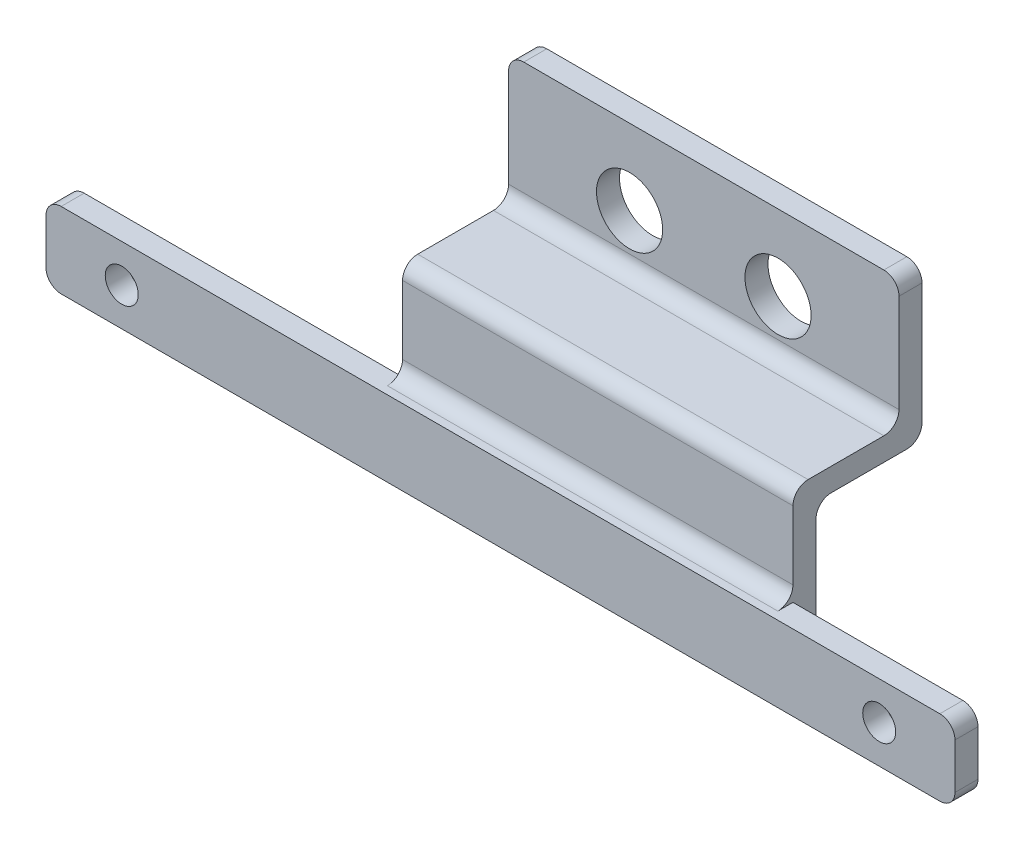
ISO-10303-21;
HEADER;
FILE_DESCRIPTION(('STEP AP214'),'2;1');
FILE_NAME('part.step','',(''),(''),'','','');
FILE_SCHEMA(('AUTOMOTIVE_DESIGN { 1 0 10303 214 1 1 1 1 }'));
ENDSEC;
DATA;
#1=APPLICATION_CONTEXT('core data for automotive mechanical design processes');
#2=APPLICATION_PROTOCOL_DEFINITION('international standard','automotive_design',2000,#1);
#3=PRODUCT_CONTEXT('',#1,'mechanical');
#4=PRODUCT('Part','Part','',(#3));
#5=PRODUCT_RELATED_PRODUCT_CATEGORY('part','',(#4));
#6=PRODUCT_DEFINITION_FORMATION('','',#4);
#7=PRODUCT_DEFINITION_CONTEXT('part definition',#1,'design');
#8=PRODUCT_DEFINITION('design','',#6,#7);
#9=PRODUCT_DEFINITION_SHAPE('','',#8);
#10=(LENGTH_UNIT() NAMED_UNIT(*) SI_UNIT(.MILLI.,.METRE.));
#11=(NAMED_UNIT(*) PLANE_ANGLE_UNIT() SI_UNIT($,.RADIAN.));
#12=(NAMED_UNIT(*) SI_UNIT($,.STERADIAN.) SOLID_ANGLE_UNIT());
#13=UNCERTAINTY_MEASURE_WITH_UNIT(LENGTH_MEASURE(1.E-05),#10,'distance_accuracy_value','');
#14=(GEOMETRIC_REPRESENTATION_CONTEXT(3) GLOBAL_UNCERTAINTY_ASSIGNED_CONTEXT((#13)) GLOBAL_UNIT_ASSIGNED_CONTEXT((#10,
#11,#12)) REPRESENTATION_CONTEXT('',''));
#15=CARTESIAN_POINT('',(0.,0.,0.));
#16=DIRECTION('',(0.,0.,1.));
#17=DIRECTION('',(1.,0.,0.));
#18=AXIS2_PLACEMENT_3D('',#15,#16,#17);
#19=CARTESIAN_POINT('',(0.,0.,8.52));
#20=DIRECTION('',(0.,0.,-1.));
#21=DIRECTION('',(-1.,0.,0.));
#22=AXIS2_PLACEMENT_3D('',#19,#20,#21);
#23=PLANE('',#22);
#24=DIRECTION('',(0.,1.,0.));
#25=VECTOR('',#24,1.);
#26=CARTESIAN_POINT('',(12.885,-3.48,8.52));
#27=LINE('',#26,#25);
#28=CARTESIAN_POINT('',(12.885,-9.,8.52));
#29=VERTEX_POINT('',#28);
#30=CARTESIAN_POINT('',(12.885,-4.48,8.52));
#31=VERTEX_POINT('',#30);
#32=EDGE_CURVE('E315',#29,#31,#27,.T.);
#33=ORIENTED_EDGE('',*,*,#32,.T.);
#34=DIRECTION('',(-1.,0.,0.));
#35=VECTOR('',#34,1.);
#36=CARTESIAN_POINT('',(0.,-4.48,8.52));
#37=LINE('',#36,#35);
#38=CARTESIAN_POINT('',(-12.885,-4.48,8.52));
#39=VERTEX_POINT('',#38);
#40=EDGE_CURVE('E471',#31,#39,#37,.T.);
#41=ORIENTED_EDGE('',*,*,#40,.T.);
#42=DIRECTION('',(0.,-1.,0.));
#43=VECTOR('',#42,1.);
#44=CARTESIAN_POINT('',(-12.885,-5.,8.52));
#45=LINE('',#44,#43);
#46=CARTESIAN_POINT('',(-12.885,-9.,8.52));
#47=VERTEX_POINT('',#46);
#48=EDGE_CURVE('E229',#39,#47,#45,.T.);
#49=ORIENTED_EDGE('',*,*,#48,.T.);
#50=DIRECTION('',(-1.,0.,0.));
#51=VECTOR('',#50,1.);
#52=CARTESIAN_POINT('',(12.885,-9.,8.52));
#53=LINE('',#52,#51);
#54=EDGE_CURVE('E469',#47,#29,#53,.F.);
#55=ORIENTED_EDGE('',*,*,#54,.T.);
#56=EDGE_LOOP('',(#33,#41,#49,#55));
#57=FACE_BOUND('',#56,.T.);
#58=ADVANCED_FACE('F33',(#57),#23,.F.);
#59=CARTESIAN_POINT('',(-12.885,-5.,1.52));
#60=DIRECTION('',(0.,1.,0.));
#61=DIRECTION('',(0.,0.,1.));
#62=AXIS2_PLACEMENT_3D('',#59,#60,#61);
#63=PLANE('',#62);
#64=DIRECTION('',(0.,0.,-1.));
#65=VECTOR('',#64,1.);
#66=CARTESIAN_POINT('',(12.885,-5.,1.52));
#67=LINE('',#66,#65);
#68=CARTESIAN_POINT('',(12.885,-5.,6.));
#69=VERTEX_POINT('',#68);
#70=CARTESIAN_POINT('',(12.885,-5.,1.));
#71=VERTEX_POINT('',#70);
#72=EDGE_CURVE('E284',#69,#71,#67,.T.);
#73=ORIENTED_EDGE('',*,*,#72,.F.);
#74=DIRECTION('',(1.,0.,0.));
#75=VECTOR('',#74,1.);
#76=CARTESIAN_POINT('',(-12.885,-5.,6.));
#77=LINE('',#76,#75);
#78=CARTESIAN_POINT('',(-12.885,-5.,6.));
#79=VERTEX_POINT('',#78);
#80=EDGE_CURVE('E402',#69,#79,#77,.F.);
#81=ORIENTED_EDGE('',*,*,#80,.T.);
#82=DIRECTION('',(0.,0.,-1.));
#83=VECTOR('',#82,1.);
#84=CARTESIAN_POINT('',(-12.885,-5.,1.52));
#85=LINE('',#84,#83);
#86=CARTESIAN_POINT('',(-12.885,-5.,1.));
#87=VERTEX_POINT('',#86);
#88=EDGE_CURVE('E263',#79,#87,#85,.T.);
#89=ORIENTED_EDGE('',*,*,#88,.T.);
#90=DIRECTION('',(1.,0.,0.));
#91=VECTOR('',#90,1.);
#92=CARTESIAN_POINT('',(-12.885,-5.,1.));
#93=LINE('',#92,#91);
#94=EDGE_CURVE('E399',#87,#71,#93,.T.);
#95=ORIENTED_EDGE('',*,*,#94,.T.);
#96=EDGE_LOOP('',(#73,#81,#89,#95));
#97=FACE_BOUND('',#96,.T.);
#98=ADVANCED_FACE('F528',(#97),#63,.F.);
#99=CARTESIAN_POINT('',(0.,0.,1.52));
#100=DIRECTION('',(0.,0.,1.));
#101=DIRECTION('',(1.,0.,0.));
#102=AXIS2_PLACEMENT_3D('',#99,#100,#101);
#103=PLANE('',#102);
#104=DIRECTION('',(0.,-1.,0.));
#105=VECTOR('',#104,1.);
#106=CARTESIAN_POINT('',(-12.885,5.,1.52));
#107=LINE('',#106,#105);
#108=CARTESIAN_POINT('',(-12.885,4.,1.52));
#109=VERTEX_POINT('',#108);
#110=CARTESIAN_POINT('',(-12.885,-2.48,1.52));
#111=VERTEX_POINT('',#110);
#112=EDGE_CURVE('E274',#109,#111,#107,.T.);
#113=ORIENTED_EDGE('',*,*,#112,.T.);
#114=DIRECTION('',(-1.,0.,0.));
#115=VECTOR('',#114,1.);
#116=CARTESIAN_POINT('',(0.,-2.48,1.52));
#117=LINE('',#116,#115);
#118=CARTESIAN_POINT('',(12.885,-2.48,1.52));
#119=VERTEX_POINT('',#118);
#120=EDGE_CURVE('E414',#111,#119,#117,.F.);
#121=ORIENTED_EDGE('',*,*,#120,.T.);
#122=DIRECTION('',(0.,1.,0.));
#123=VECTOR('',#122,1.);
#124=CARTESIAN_POINT('',(12.885,5.,1.52));
#125=LINE('',#124,#123);
#126=CARTESIAN_POINT('',(12.885,4.,1.52));
#127=VERTEX_POINT('',#126);
#128=EDGE_CURVE('E269',#119,#127,#125,.T.);
#129=ORIENTED_EDGE('',*,*,#128,.T.);
#130=CARTESIAN_POINT('',(11.885,4.,1.52));
#131=DIRECTION('',(0.,0.,1.));
#132=DIRECTION('',(1.,0.,0.));
#133=AXIS2_PLACEMENT_3D('',#130,#131,#132);
#134=CIRCLE('',#133,1.);
#135=CARTESIAN_POINT('',(11.885,5.,1.52));
#136=VERTEX_POINT('',#135);
#137=EDGE_CURVE('E410',#127,#136,#134,.T.);
#138=ORIENTED_EDGE('',*,*,#137,.T.);
#139=DIRECTION('',(-1.,0.,0.));
#140=VECTOR('',#139,1.);
#141=CARTESIAN_POINT('',(-12.885,5.,1.52));
#142=LINE('',#141,#140);
#143=CARTESIAN_POINT('',(-11.885,5.,1.52));
#144=VERTEX_POINT('',#143);
#145=EDGE_CURVE('E273',#136,#144,#142,.T.);
#146=ORIENTED_EDGE('',*,*,#145,.T.);
#147=CARTESIAN_POINT('',(-11.885,4.,1.52));
#148=DIRECTION('',(0.,0.,1.));
#149=DIRECTION('',(1.,0.,0.));
#150=AXIS2_PLACEMENT_3D('',#147,#148,#149);
#151=CIRCLE('',#150,1.);
#152=EDGE_CURVE('E412',#144,#109,#151,.T.);
#153=ORIENTED_EDGE('',*,*,#152,.T.);
#154=EDGE_LOOP('',(#113,#121,#129,#138,#146,#153));
#155=FACE_BOUND('',#154,.T.);
#156=CARTESIAN_POINT('',(-4.89999999999999,0.,1.52));
#157=DIRECTION('',(0.,0.,1.));
#158=DIRECTION('',(1.,0.,0.));
#159=AXIS2_PLACEMENT_3D('',#156,#157,#158);
#160=CIRCLE('',#159,2.18499999999998);
#161=CARTESIAN_POINT('',(-2.71500000000001,0.,1.52));
#162=VERTEX_POINT('',#161);
#163=EDGE_CURVE('E289',#162,#162,#160,.T.);
#164=ORIENTED_EDGE('',*,*,#163,.F.);
#165=EDGE_LOOP('',(#164));
#166=FACE_BOUND('',#165,.T.);
#167=CARTESIAN_POINT('',(4.90000000000002,0.,1.52));
#168=DIRECTION('',(0.,0.,1.));
#169=DIRECTION('',(1.,0.,0.));
#170=AXIS2_PLACEMENT_3D('',#167,#168,#169);
#171=CIRCLE('',#170,2.185);
#172=CARTESIAN_POINT('',(7.08500000000001,0.,1.52));
#173=VERTEX_POINT('',#172);
#174=EDGE_CURVE('E329',#173,#173,#171,.T.);
#175=ORIENTED_EDGE('',*,*,#174,.F.);
#176=EDGE_LOOP('',(#175));
#177=FACE_BOUND('',#176,.T.);
#178=ADVANCED_FACE('F438',(#155,#166,#177),#103,.T.);
#179=CARTESIAN_POINT('',(0.,0.,0.));
#180=DIRECTION('',(0.,0.,1.));
#181=DIRECTION('',(1.,0.,0.));
#182=AXIS2_PLACEMENT_3D('',#179,#180,#181);
#183=PLANE('',#182);
#184=DIRECTION('',(0.,1.,0.));
#185=VECTOR('',#184,1.);
#186=CARTESIAN_POINT('',(12.885,5.,0.));
#187=LINE('',#186,#185);
#188=CARTESIAN_POINT('',(12.885,-4.,0.));
#189=VERTEX_POINT('',#188);
#190=CARTESIAN_POINT('',(12.885,4.,0.));
#191=VERTEX_POINT('',#190);
#192=EDGE_CURVE('E288',#189,#191,#187,.T.);
#193=ORIENTED_EDGE('',*,*,#192,.F.);
#194=DIRECTION('',(1.,0.,0.));
#195=VECTOR('',#194,1.);
#196=CARTESIAN_POINT('',(0.,-4.,0.));
#197=LINE('',#196,#195);
#198=CARTESIAN_POINT('',(-12.885,-4.,0.));
#199=VERTEX_POINT('',#198);
#200=EDGE_CURVE('E408',#189,#199,#197,.F.);
#201=ORIENTED_EDGE('',*,*,#200,.T.);
#202=DIRECTION('',(0.,-1.,0.));
#203=VECTOR('',#202,1.);
#204=CARTESIAN_POINT('',(-12.885,5.,0.));
#205=LINE('',#204,#203);
#206=CARTESIAN_POINT('',(-12.885,4.,0.));
#207=VERTEX_POINT('',#206);
#208=EDGE_CURVE('E285',#207,#199,#205,.T.);
#209=ORIENTED_EDGE('',*,*,#208,.F.);
#210=CARTESIAN_POINT('',(-11.885,4.,0.));
#211=DIRECTION('',(0.,0.,1.));
#212=DIRECTION('',(1.,0.,0.));
#213=AXIS2_PLACEMENT_3D('',#210,#211,#212);
#214=CIRCLE('',#213,1.);
#215=CARTESIAN_POINT('',(-11.885,5.,0.));
#216=VERTEX_POINT('',#215);
#217=EDGE_CURVE('E406',#207,#216,#214,.F.);
#218=ORIENTED_EDGE('',*,*,#217,.T.);
#219=DIRECTION('',(-1.,0.,0.));
#220=VECTOR('',#219,1.);
#221=CARTESIAN_POINT('',(-12.885,5.,0.));
#222=LINE('',#221,#220);
#223=CARTESIAN_POINT('',(11.885,5.,0.));
#224=VERTEX_POINT('',#223);
#225=EDGE_CURVE('E292',#224,#216,#222,.T.);
#226=ORIENTED_EDGE('',*,*,#225,.F.);
#227=CARTESIAN_POINT('',(11.885,4.,0.));
#228=DIRECTION('',(0.,0.,1.));
#229=DIRECTION('',(1.,0.,0.));
#230=AXIS2_PLACEMENT_3D('',#227,#228,#229);
#231=CIRCLE('',#230,1.);
#232=EDGE_CURVE('E404',#224,#191,#231,.F.);
#233=ORIENTED_EDGE('',*,*,#232,.T.);
#234=EDGE_LOOP('',(#193,#201,#209,#218,#226,#233));
#235=FACE_BOUND('',#234,.T.);
#236=CARTESIAN_POINT('',(-4.89999999999999,0.,0.));
#237=DIRECTION('',(0.,0.,1.));
#238=DIRECTION('',(1.,0.,0.));
#239=AXIS2_PLACEMENT_3D('',#236,#237,#238);
#240=CIRCLE('',#239,2.18499999999998);
#241=CARTESIAN_POINT('',(-2.71500000000001,0.,0.));
#242=VERTEX_POINT('',#241);
#243=EDGE_CURVE('E755',#242,#242,#240,.T.);
#244=ORIENTED_EDGE('',*,*,#243,.T.);
#245=EDGE_LOOP('',(#244));
#246=FACE_BOUND('',#245,.T.);
#247=CARTESIAN_POINT('',(4.90000000000002,0.,0.));
#248=DIRECTION('',(0.,0.,1.));
#249=DIRECTION('',(1.,0.,0.));
#250=AXIS2_PLACEMENT_3D('',#247,#248,#249);
#251=CIRCLE('',#250,2.185);
#252=CARTESIAN_POINT('',(7.08500000000001,0.,0.));
#253=VERTEX_POINT('',#252);
#254=EDGE_CURVE('E453',#253,#253,#251,.T.);
#255=ORIENTED_EDGE('',*,*,#254,.T.);
#256=EDGE_LOOP('',(#255));
#257=FACE_BOUND('',#256,.T.);
#258=ADVANCED_FACE('F552',(#235,#246,#257),#183,.F.);
#259=CARTESIAN_POINT('',(-12.885,5.,1.52));
#260=DIRECTION('',(1.,0.,0.));
#261=DIRECTION('',(0.,0.,-1.));
#262=AXIS2_PLACEMENT_3D('',#259,#260,#261);
#263=PLANE('',#262);
#264=DIRECTION('',(0.,1.,0.));
#265=VECTOR('',#264,1.);
#266=CARTESIAN_POINT('',(-12.885,-15.,7.));
#267=LINE('',#266,#265);
#268=CARTESIAN_POINT('',(-12.885,-14.,7.));
#269=VERTEX_POINT('',#268);
#270=CARTESIAN_POINT('',(-12.885,-6.,7.));
#271=VERTEX_POINT('',#270);
#272=EDGE_CURVE('E311',#269,#271,#267,.T.);
#273=ORIENTED_EDGE('',*,*,#272,.F.);
#274=CARTESIAN_POINT('',(-12.885,-14.,8.));
#275=DIRECTION('',(1.,0.,0.));
#276=DIRECTION('',(0.,0.,-1.));
#277=AXIS2_PLACEMENT_3D('',#274,#275,#276);
#278=CIRCLE('',#277,1.);
#279=CARTESIAN_POINT('',(-12.885,-15.,8.));
#280=VERTEX_POINT('',#279);
#281=EDGE_CURVE('E467',#269,#280,#278,.F.);
#282=ORIENTED_EDGE('',*,*,#281,.T.);
#283=DIRECTION('',(0.,0.,-1.));
#284=VECTOR('',#283,1.);
#285=CARTESIAN_POINT('',(-12.885,-15.,8.52));
#286=LINE('',#285,#284);
#287=CARTESIAN_POINT('',(-12.885,-15.,8.52));
#288=VERTEX_POINT('',#287);
#289=EDGE_CURVE('E226',#288,#280,#286,.T.);
#290=ORIENTED_EDGE('',*,*,#289,.F.);
#291=CARTESIAN_POINT('',(-12.885,-10.,8.52));
#292=VERTEX_POINT('',#291);
#293=EDGE_CURVE('E222',#292,#288,#45,.T.);
#294=ORIENTED_EDGE('',*,*,#293,.F.);
#295=DIRECTION('',(0.,0.,-1.));
#296=VECTOR('',#295,1.);
#297=CARTESIAN_POINT('',(-12.885,-10.,1.52));
#298=LINE('',#297,#296);
#299=CARTESIAN_POINT('',(-12.885,-10.,9.52));
#300=VERTEX_POINT('',#299);
#301=EDGE_CURVE('E209',#300,#292,#298,.T.);
#302=ORIENTED_EDGE('',*,*,#301,.F.);
#303=CARTESIAN_POINT('',(-12.885,-9.,9.52));
#304=DIRECTION('',(1.,0.,0.));
#305=DIRECTION('',(0.,0.,-1.));
#306=AXIS2_PLACEMENT_3D('',#303,#304,#305);
#307=CIRCLE('',#306,1.);
#308=EDGE_CURVE('E420',#300,#47,#307,.T.);
#309=ORIENTED_EDGE('',*,*,#308,.T.);
#310=ORIENTED_EDGE('',*,*,#48,.F.);
#311=CARTESIAN_POINT('',(-12.885,-4.48,7.52));
#312=DIRECTION('',(1.,0.,0.));
#313=DIRECTION('',(0.,0.,-1.));
#314=AXIS2_PLACEMENT_3D('',#311,#312,#313);
#315=CIRCLE('',#314,1.);
#316=CARTESIAN_POINT('',(-12.885,-3.48,7.52));
#317=VERTEX_POINT('',#316);
#318=EDGE_CURVE('E465',#39,#317,#315,.F.);
#319=ORIENTED_EDGE('',*,*,#318,.T.);
#320=DIRECTION('',(0.,0.,-1.));
#321=VECTOR('',#320,1.);
#322=CARTESIAN_POINT('',(-12.885,-3.48,8.52));
#323=LINE('',#322,#321);
#324=CARTESIAN_POINT('',(-12.885,-3.48,2.52));
#325=VERTEX_POINT('',#324);
#326=EDGE_CURVE('E328',#317,#325,#323,.T.);
#327=ORIENTED_EDGE('',*,*,#326,.T.);
#328=CARTESIAN_POINT('',(-12.885,-2.48,2.52));
#329=DIRECTION('',(1.,0.,0.));
#330=DIRECTION('',(0.,0.,-1.));
#331=AXIS2_PLACEMENT_3D('',#328,#329,#330);
#332=CIRCLE('',#331,1.);
#333=EDGE_CURVE('E41',#325,#111,#332,.T.);
#334=ORIENTED_EDGE('',*,*,#333,.T.);
#335=ORIENTED_EDGE('',*,*,#112,.F.);
#336=DIRECTION('',(0.,0.,-1.));
#337=VECTOR('',#336,1.);
#338=CARTESIAN_POINT('',(-12.885,4.,1.52));
#339=LINE('',#338,#337);
#340=EDGE_CURVE('E460',#109,#207,#339,.T.);
#341=ORIENTED_EDGE('',*,*,#340,.T.);
#342=ORIENTED_EDGE('',*,*,#208,.T.);
#343=CARTESIAN_POINT('',(-12.885,-4.,1.));
#344=DIRECTION('',(1.,0.,0.));
#345=DIRECTION('',(0.,0.,-1.));
#346=AXIS2_PLACEMENT_3D('',#343,#344,#345);
#347=CIRCLE('',#346,1.);
#348=EDGE_CURVE('E462',#199,#87,#347,.F.);
#349=ORIENTED_EDGE('',*,*,#348,.T.);
#350=ORIENTED_EDGE('',*,*,#88,.F.);
#351=CARTESIAN_POINT('',(-12.885,-6.,6.));
#352=DIRECTION('',(1.,0.,0.));
#353=DIRECTION('',(0.,0.,-1.));
#354=AXIS2_PLACEMENT_3D('',#351,#352,#353);
#355=CIRCLE('',#354,1.);
#356=EDGE_CURVE('E426',#79,#271,#355,.T.);
#357=ORIENTED_EDGE('',*,*,#356,.T.);
#358=EDGE_LOOP('',(#273,#282,#290,#294,#302,#309,#310,#319,#327,#334,#335,#341,#342,#349,#350,#357));
#359=FACE_BOUND('',#358,.T.);
#360=ADVANCED_FACE('F224',(#359),#263,.F.);
#361=CARTESIAN_POINT('',(12.885,5.,1.52));
#362=DIRECTION('',(-1.,0.,0.));
#363=DIRECTION('',(0.,0.,1.));
#364=AXIS2_PLACEMENT_3D('',#361,#362,#363);
#365=PLANE('',#364);
#366=DIRECTION('',(0.,0.,1.));
#367=VECTOR('',#366,1.);
#368=CARTESIAN_POINT('',(12.885,-15.,7.));
#369=LINE('',#368,#367);
#370=CARTESIAN_POINT('',(12.885,-15.,8.));
#371=VERTEX_POINT('',#370);
#372=CARTESIAN_POINT('',(12.885,-15.,8.52));
#373=VERTEX_POINT('',#372);
#374=EDGE_CURVE('E256',#371,#373,#369,.T.);
#375=ORIENTED_EDGE('',*,*,#374,.F.);
#376=CARTESIAN_POINT('',(12.885,-14.,8.));
#377=DIRECTION('',(-1.,0.,0.));
#378=DIRECTION('',(0.,0.,1.));
#379=AXIS2_PLACEMENT_3D('',#376,#377,#378);
#380=CIRCLE('',#379,1.);
#381=CARTESIAN_POINT('',(12.885,-14.,7.));
#382=VERTEX_POINT('',#381);
#383=EDGE_CURVE('E308',#371,#382,#380,.F.);
#384=ORIENTED_EDGE('',*,*,#383,.T.);
#385=DIRECTION('',(0.,1.,0.));
#386=VECTOR('',#385,1.);
#387=CARTESIAN_POINT('',(12.885,-15.,7.));
#388=LINE('',#387,#386);
#389=CARTESIAN_POINT('',(12.885,-6.,7.));
#390=VERTEX_POINT('',#389);
#391=EDGE_CURVE('E301',#382,#390,#388,.T.);
#392=ORIENTED_EDGE('',*,*,#391,.T.);
#393=CARTESIAN_POINT('',(12.885,-6.,6.));
#394=DIRECTION('',(-1.,0.,0.));
#395=DIRECTION('',(0.,0.,1.));
#396=AXIS2_PLACEMENT_3D('',#393,#394,#395);
#397=CIRCLE('',#396,1.);
#398=EDGE_CURVE('E424',#390,#69,#397,.T.);
#399=ORIENTED_EDGE('',*,*,#398,.T.);
#400=ORIENTED_EDGE('',*,*,#72,.T.);
#401=CARTESIAN_POINT('',(12.885,-4.,1.));
#402=DIRECTION('',(-1.,0.,0.));
#403=DIRECTION('',(0.,0.,1.));
#404=AXIS2_PLACEMENT_3D('',#401,#402,#403);
#405=CIRCLE('',#404,1.);
#406=EDGE_CURVE('E304',#71,#189,#405,.F.);
#407=ORIENTED_EDGE('',*,*,#406,.T.);
#408=ORIENTED_EDGE('',*,*,#192,.T.);
#409=DIRECTION('',(0.,0.,-1.));
#410=VECTOR('',#409,1.);
#411=CARTESIAN_POINT('',(12.885,4.,1.52));
#412=LINE('',#411,#410);
#413=EDGE_CURVE('E268',#191,#127,#412,.F.);
#414=ORIENTED_EDGE('',*,*,#413,.T.);
#415=ORIENTED_EDGE('',*,*,#128,.F.);
#416=CARTESIAN_POINT('',(12.885,-2.48,2.52));
#417=DIRECTION('',(-1.,0.,0.));
#418=DIRECTION('',(0.,0.,1.));
#419=AXIS2_PLACEMENT_3D('',#416,#417,#418);
#420=CIRCLE('',#419,1.);
#421=CARTESIAN_POINT('',(12.885,-3.48,2.52));
#422=VERTEX_POINT('',#421);
#423=EDGE_CURVE('E11',#119,#422,#420,.T.);
#424=ORIENTED_EDGE('',*,*,#423,.T.);
#425=DIRECTION('',(0.,0.,-1.));
#426=VECTOR('',#425,1.);
#427=CARTESIAN_POINT('',(12.885,-3.48,8.52));
#428=LINE('',#427,#426);
#429=CARTESIAN_POINT('',(12.885,-3.48,7.52));
#430=VERTEX_POINT('',#429);
#431=EDGE_CURVE('E275',#430,#422,#428,.T.);
#432=ORIENTED_EDGE('',*,*,#431,.F.);
#433=CARTESIAN_POINT('',(12.885,-4.48,7.52));
#434=DIRECTION('',(-1.,0.,0.));
#435=DIRECTION('',(0.,0.,1.));
#436=AXIS2_PLACEMENT_3D('',#433,#434,#435);
#437=CIRCLE('',#436,1.);
#438=EDGE_CURVE('E306',#430,#31,#437,.F.);
#439=ORIENTED_EDGE('',*,*,#438,.T.);
#440=ORIENTED_EDGE('',*,*,#32,.F.);
#441=CARTESIAN_POINT('',(12.885,-9.,9.52));
#442=DIRECTION('',(-1.,0.,0.));
#443=DIRECTION('',(0.,0.,1.));
#444=AXIS2_PLACEMENT_3D('',#441,#442,#443);
#445=CIRCLE('',#444,1.);
#446=CARTESIAN_POINT('',(12.885,-10.,9.52));
#447=VERTEX_POINT('',#446);
#448=EDGE_CURVE('E422',#29,#447,#445,.T.);
#449=ORIENTED_EDGE('',*,*,#448,.T.);
#450=DIRECTION('',(0.,0.,1.));
#451=VECTOR('',#450,1.);
#452=CARTESIAN_POINT('',(12.885,-10.,1.52));
#453=LINE('',#452,#451);
#454=CARTESIAN_POINT('',(12.885,-10.,8.52));
#455=VERTEX_POINT('',#454);
#456=EDGE_CURVE('E48',#455,#447,#453,.T.);
#457=ORIENTED_EDGE('',*,*,#456,.F.);
#458=EDGE_CURVE('E230',#373,#455,#27,.T.);
#459=ORIENTED_EDGE('',*,*,#458,.F.);
#460=EDGE_LOOP('',(#375,#384,#392,#399,#400,#407,#408,#414,#415,#424,#432,#439,#440,#449,#457,#459));
#461=FACE_BOUND('',#460,.T.);
#462=ADVANCED_FACE('F368',(#461),#365,.F.);
#463=CARTESIAN_POINT('',(-12.885,5.,1.52));
#464=DIRECTION('',(0.,-1.,0.));
#465=DIRECTION('',(1.,0.,0.));
#466=AXIS2_PLACEMENT_3D('',#463,#464,#465);
#467=PLANE('',#466);
#468=ORIENTED_EDGE('',*,*,#225,.T.);
#469=DIRECTION('',(0.,0.,-1.));
#470=VECTOR('',#469,1.);
#471=CARTESIAN_POINT('',(-11.885,5.,1.52));
#472=LINE('',#471,#470);
#473=EDGE_CURVE('E56',#216,#144,#472,.F.);
#474=ORIENTED_EDGE('',*,*,#473,.T.);
#475=ORIENTED_EDGE('',*,*,#145,.F.);
#476=DIRECTION('',(0.,0.,-1.));
#477=VECTOR('',#476,1.);
#478=CARTESIAN_POINT('',(11.885,5.,1.52));
#479=LINE('',#478,#477);
#480=EDGE_CURVE('E416',#136,#224,#479,.T.);
#481=ORIENTED_EDGE('',*,*,#480,.T.);
#482=EDGE_LOOP('',(#468,#474,#475,#481));
#483=FACE_BOUND('',#482,.T.);
#484=ADVANCED_FACE('F548',(#483),#467,.F.);
#485=CARTESIAN_POINT('',(-4.89999999999999,0.,1.52));
#486=DIRECTION('',(0.,0.,-1.));
#487=DIRECTION('',(-1.,0.,0.));
#488=AXIS2_PLACEMENT_3D('',#485,#486,#487);
#489=CYLINDRICAL_SURFACE('',#488,2.18499999999998);
#490=ORIENTED_EDGE('',*,*,#163,.T.);
#491=EDGE_LOOP('',(#490));
#492=FACE_BOUND('',#491,.T.);
#493=ORIENTED_EDGE('',*,*,#243,.F.);
#494=EDGE_LOOP('',(#493));
#495=FACE_BOUND('',#494,.T.);
#496=ADVANCED_FACE('F544',(#492,#495),#489,.F.);
#497=CARTESIAN_POINT('',(4.90000000000002,0.,1.52));
#498=DIRECTION('',(0.,0.,-1.));
#499=DIRECTION('',(-1.,0.,0.));
#500=AXIS2_PLACEMENT_3D('',#497,#498,#499);
#501=CYLINDRICAL_SURFACE('',#500,2.185);
#502=ORIENTED_EDGE('',*,*,#174,.T.);
#503=EDGE_LOOP('',(#502));
#504=FACE_BOUND('',#503,.T.);
#505=ORIENTED_EDGE('',*,*,#254,.F.);
#506=EDGE_LOOP('',(#505));
#507=FACE_BOUND('',#506,.T.);
#508=ADVANCED_FACE('F542',(#504,#507),#501,.F.);
#509=CARTESIAN_POINT('',(-12.885,-3.48,8.52));
#510=DIRECTION('',(0.,-1.,0.));
#511=DIRECTION('',(0.,0.,-1.));
#512=AXIS2_PLACEMENT_3D('',#509,#510,#511);
#513=PLANE('',#512);
#514=ORIENTED_EDGE('',*,*,#326,.F.);
#515=DIRECTION('',(-1.,0.,0.));
#516=VECTOR('',#515,1.);
#517=CARTESIAN_POINT('',(-12.885,-3.48,7.52));
#518=LINE('',#517,#516);
#519=EDGE_CURVE('E452',#317,#430,#518,.F.);
#520=ORIENTED_EDGE('',*,*,#519,.T.);
#521=ORIENTED_EDGE('',*,*,#431,.T.);
#522=DIRECTION('',(-1.,0.,0.));
#523=VECTOR('',#522,1.);
#524=CARTESIAN_POINT('',(-12.885,-3.48,2.52));
#525=LINE('',#524,#523);
#526=EDGE_CURVE('E445',#422,#325,#525,.T.);
#527=ORIENTED_EDGE('',*,*,#526,.T.);
#528=EDGE_LOOP('',(#514,#520,#521,#527));
#529=FACE_BOUND('',#528,.T.);
#530=ADVANCED_FACE('F450',(#529),#513,.F.);
#531=CARTESIAN_POINT('',(-12.885,-15.,7.));
#532=DIRECTION('',(0.,0.,1.));
#533=DIRECTION('',(1.,0.,0.));
#534=AXIS2_PLACEMENT_3D('',#531,#532,#533);
#535=PLANE('',#534);
#536=ORIENTED_EDGE('',*,*,#391,.F.);
#537=DIRECTION('',(1.,0.,0.));
#538=VECTOR('',#537,1.);
#539=CARTESIAN_POINT('',(-12.885,-14.,7.));
#540=LINE('',#539,#538);
#541=EDGE_CURVE('E463',#382,#269,#540,.F.);
#542=ORIENTED_EDGE('',*,*,#541,.T.);
#543=ORIENTED_EDGE('',*,*,#272,.T.);
#544=DIRECTION('',(1.,0.,0.));
#545=VECTOR('',#544,1.);
#546=CARTESIAN_POINT('',(12.885,-6.,7.));
#547=LINE('',#546,#545);
#548=EDGE_CURVE('E310',#271,#390,#547,.T.);
#549=ORIENTED_EDGE('',*,*,#548,.T.);
#550=EDGE_LOOP('',(#536,#542,#543,#549));
#551=FACE_BOUND('',#550,.T.);
#552=ADVANCED_FACE('F538',(#551),#535,.F.);
#553=CARTESIAN_POINT('',(0.,-15.,0.));
#554=DIRECTION('',(0.,-1.,0.));
#555=DIRECTION('',(0.,0.,-1.));
#556=AXIS2_PLACEMENT_3D('',#553,#554,#555);
#557=PLANE('',#556);
#558=ORIENTED_EDGE('',*,*,#289,.T.);
#559=DIRECTION('',(1.,0.,0.));
#560=VECTOR('',#559,1.);
#561=CARTESIAN_POINT('',(12.885,-15.,8.));
#562=LINE('',#561,#560);
#563=EDGE_CURVE('E265',#280,#371,#562,.T.);
#564=ORIENTED_EDGE('',*,*,#563,.T.);
#565=ORIENTED_EDGE('',*,*,#374,.T.);
#566=DIRECTION('',(1.,0.,0.));
#567=VECTOR('',#566,1.);
#568=CARTESIAN_POINT('',(-12.885,-15.,8.52));
#569=LINE('',#568,#567);
#570=CARTESIAN_POINT('',(24.1,-15.,8.52));
#571=VERTEX_POINT('',#570);
#572=EDGE_CURVE('E246',#373,#571,#569,.T.);
#573=ORIENTED_EDGE('',*,*,#572,.T.);
#574=DIRECTION('',(0.,0.,-1.));
#575=VECTOR('',#574,1.);
#576=CARTESIAN_POINT('',(24.1,-15.,10.04));
#577=LINE('',#576,#575);
#578=CARTESIAN_POINT('',(24.1,-15.,10.04));
#579=VERTEX_POINT('',#578);
#580=EDGE_CURVE('E262',#571,#579,#577,.F.);
#581=ORIENTED_EDGE('',*,*,#580,.T.);
#582=DIRECTION('',(1.,0.,0.));
#583=VECTOR('',#582,1.);
#584=CARTESIAN_POINT('',(25.1,-15.,10.04));
#585=LINE('',#584,#583);
#586=CARTESIAN_POINT('',(-33.9,-15.,10.04));
#587=VERTEX_POINT('',#586);
#588=EDGE_CURVE('E255',#587,#579,#585,.T.);
#589=ORIENTED_EDGE('',*,*,#588,.F.);
#590=DIRECTION('',(0.,0.,-1.));
#591=VECTOR('',#590,1.);
#592=CARTESIAN_POINT('',(-33.9,-15.,8.52));
#593=LINE('',#592,#591);
#594=CARTESIAN_POINT('',(-33.9,-15.,8.52));
#595=VERTEX_POINT('',#594);
#596=EDGE_CURVE('E259',#587,#595,#593,.T.);
#597=ORIENTED_EDGE('',*,*,#596,.T.);
#598=EDGE_CURVE('E252',#595,#288,#569,.T.);
#599=ORIENTED_EDGE('',*,*,#598,.T.);
#600=EDGE_LOOP('',(#558,#564,#565,#573,#581,#589,#597,#599));
#601=FACE_BOUND('',#600,.T.);
#602=ADVANCED_FACE('F364',(#601),#557,.T.);
#603=CARTESIAN_POINT('',(0.,0.,8.52));
#604=DIRECTION('',(0.,0.,-1.));
#605=DIRECTION('',(-1.,0.,0.));
#606=AXIS2_PLACEMENT_3D('',#603,#604,#605);
#607=PLANE('',#606);
#608=CARTESIAN_POINT('',(-29.9,-12.5,8.52));
#609=DIRECTION('',(0.,0.,-1.));
#610=DIRECTION('',(-1.,0.,0.));
#611=AXIS2_PLACEMENT_3D('',#608,#609,#610);
#612=CIRCLE('',#611,1.09);
#613=CARTESIAN_POINT('',(-30.99,-12.5,8.52));
#614=VERTEX_POINT('',#613);
#615=EDGE_CURVE('E240',#614,#614,#612,.T.);
#616=ORIENTED_EDGE('',*,*,#615,.F.);
#617=EDGE_LOOP('',(#616));
#618=FACE_BOUND('',#617,.T.);
#619=ORIENTED_EDGE('',*,*,#598,.F.);
#620=CARTESIAN_POINT('',(-33.9,-14.,8.52));
#621=DIRECTION('',(0.,0.,-1.));
#622=DIRECTION('',(-1.,0.,0.));
#623=AXIS2_PLACEMENT_3D('',#620,#621,#622);
#624=CIRCLE('',#623,1.);
#625=CARTESIAN_POINT('',(-34.9,-14.,8.52));
#626=VERTEX_POINT('',#625);
#627=EDGE_CURVE('E392',#595,#626,#624,.T.);
#628=ORIENTED_EDGE('',*,*,#627,.T.);
#629=DIRECTION('',(0.,-1.,0.));
#630=VECTOR('',#629,1.);
#631=CARTESIAN_POINT('',(-34.9,-15.,8.52));
#632=LINE('',#631,#630);
#633=CARTESIAN_POINT('',(-34.9,-11.,8.52));
#634=VERTEX_POINT('',#633);
#635=EDGE_CURVE('E238',#634,#626,#632,.T.);
#636=ORIENTED_EDGE('',*,*,#635,.F.);
#637=CARTESIAN_POINT('',(-33.9,-11.,8.52));
#638=DIRECTION('',(0.,0.,-1.));
#639=DIRECTION('',(-1.,0.,0.));
#640=AXIS2_PLACEMENT_3D('',#637,#638,#639);
#641=CIRCLE('',#640,1.);
#642=CARTESIAN_POINT('',(-33.9,-10.,8.52));
#643=VERTEX_POINT('',#642);
#644=EDGE_CURVE('E234',#634,#643,#641,.T.);
#645=ORIENTED_EDGE('',*,*,#644,.T.);
#646=DIRECTION('',(-1.,0.,0.));
#647=VECTOR('',#646,1.);
#648=CARTESIAN_POINT('',(-34.9,-10.,8.52));
#649=LINE('',#648,#647);
#650=EDGE_CURVE('E213',#292,#643,#649,.T.);
#651=ORIENTED_EDGE('',*,*,#650,.F.);
#652=ORIENTED_EDGE('',*,*,#293,.T.);
#653=EDGE_LOOP('',(#619,#628,#636,#645,#651,#652));
#654=FACE_BOUND('',#653,.T.);
#655=ADVANCED_FACE('F232',(#618,#654),#607,.T.);
#656=CARTESIAN_POINT('',(25.1,-10.,10.04));
#657=DIRECTION('',(-1.,0.,0.));
#658=DIRECTION('',(0.,-1.,0.));
#659=AXIS2_PLACEMENT_3D('',#656,#657,#658);
#660=PLANE('',#659);
#661=DIRECTION('',(0.,1.,0.));
#662=VECTOR('',#661,1.);
#663=CARTESIAN_POINT('',(25.1,-10.,10.04));
#664=LINE('',#663,#662);
#665=CARTESIAN_POINT('',(25.1,-14.,10.04));
#666=VERTEX_POINT('',#665);
#667=CARTESIAN_POINT('',(25.1,-11.,10.04));
#668=VERTEX_POINT('',#667);
#669=EDGE_CURVE('E351',#666,#668,#664,.T.);
#670=ORIENTED_EDGE('',*,*,#669,.F.);
#671=DIRECTION('',(0.,0.,-1.));
#672=VECTOR('',#671,1.);
#673=CARTESIAN_POINT('',(25.1,-14.,8.52));
#674=LINE('',#673,#672);
#675=CARTESIAN_POINT('',(25.1,-14.,8.52));
#676=VERTEX_POINT('',#675);
#677=EDGE_CURVE('E382',#666,#676,#674,.T.);
#678=ORIENTED_EDGE('',*,*,#677,.T.);
#679=DIRECTION('',(0.,1.,0.));
#680=VECTOR('',#679,1.);
#681=CARTESIAN_POINT('',(25.1,-10.,8.52));
#682=LINE('',#681,#680);
#683=CARTESIAN_POINT('',(25.1,-11.,8.52));
#684=VERTEX_POINT('',#683);
#685=EDGE_CURVE('E236',#676,#684,#682,.T.);
#686=ORIENTED_EDGE('',*,*,#685,.T.);
#687=DIRECTION('',(0.,0.,-1.));
#688=VECTOR('',#687,1.);
#689=CARTESIAN_POINT('',(25.1,-11.,10.04));
#690=LINE('',#689,#688);
#691=EDGE_CURVE('E218',#684,#668,#690,.F.);
#692=ORIENTED_EDGE('',*,*,#691,.T.);
#693=EDGE_LOOP('',(#670,#678,#686,#692));
#694=FACE_BOUND('',#693,.T.);
#695=ADVANCED_FACE('F485',(#694),#660,.F.);
#696=CARTESIAN_POINT('',(-34.9,-10.,10.04));
#697=DIRECTION('',(0.,-1.,0.));
#698=DIRECTION('',(0.,0.,-1.));
#699=AXIS2_PLACEMENT_3D('',#696,#697,#698);
#700=PLANE('',#699);
#701=DIRECTION('',(-1.,0.,0.));
#702=VECTOR('',#701,1.);
#703=CARTESIAN_POINT('',(-12.885,-10.,9.52));
#704=LINE('',#703,#702);
#705=EDGE_CURVE('E216',#447,#300,#704,.T.);
#706=ORIENTED_EDGE('',*,*,#705,.T.);
#707=ORIENTED_EDGE('',*,*,#301,.T.);
#708=ORIENTED_EDGE('',*,*,#650,.T.);
#709=DIRECTION('',(0.,0.,-1.));
#710=VECTOR('',#709,1.);
#711=CARTESIAN_POINT('',(-33.9,-10.,10.04));
#712=LINE('',#711,#710);
#713=CARTESIAN_POINT('',(-33.9,-10.,10.04));
#714=VERTEX_POINT('',#713);
#715=EDGE_CURVE('E476',#643,#714,#712,.F.);
#716=ORIENTED_EDGE('',*,*,#715,.T.);
#717=DIRECTION('',(-1.,0.,0.));
#718=VECTOR('',#717,1.);
#719=CARTESIAN_POINT('',(-34.9,-10.,10.04));
#720=LINE('',#719,#718);
#721=CARTESIAN_POINT('',(24.1,-10.,10.04));
#722=VERTEX_POINT('',#721);
#723=EDGE_CURVE('E354',#722,#714,#720,.T.);
#724=ORIENTED_EDGE('',*,*,#723,.F.);
#725=DIRECTION('',(0.,0.,-1.));
#726=VECTOR('',#725,1.);
#727=CARTESIAN_POINT('',(24.1,-10.,10.04));
#728=LINE('',#727,#726);
#729=CARTESIAN_POINT('',(24.1,-10.,8.52));
#730=VERTEX_POINT('',#729);
#731=EDGE_CURVE('E478',#722,#730,#728,.T.);
#732=ORIENTED_EDGE('',*,*,#731,.T.);
#733=EDGE_CURVE('E235',#730,#455,#649,.T.);
#734=ORIENTED_EDGE('',*,*,#733,.T.);
#735=ORIENTED_EDGE('',*,*,#456,.T.);
#736=EDGE_LOOP('',(#706,#707,#708,#716,#724,#732,#734,#735));
#737=FACE_BOUND('',#736,.T.);
#738=ADVANCED_FACE('F211',(#737),#700,.F.);
#739=CARTESIAN_POINT('',(-34.9,-15.,10.04));
#740=DIRECTION('',(1.,0.,0.));
#741=DIRECTION('',(0.,0.,-1.));
#742=AXIS2_PLACEMENT_3D('',#739,#740,#741);
#743=PLANE('',#742);
#744=ORIENTED_EDGE('',*,*,#635,.T.);
#745=DIRECTION('',(0.,0.,-1.));
#746=VECTOR('',#745,1.);
#747=CARTESIAN_POINT('',(-34.9,-14.,10.04));
#748=LINE('',#747,#746);
#749=CARTESIAN_POINT('',(-34.9,-14.,10.04));
#750=VERTEX_POINT('',#749);
#751=EDGE_CURVE('E397',#626,#750,#748,.F.);
#752=ORIENTED_EDGE('',*,*,#751,.T.);
#753=DIRECTION('',(0.,-1.,0.));
#754=VECTOR('',#753,1.);
#755=CARTESIAN_POINT('',(-34.9,-15.,10.04));
#756=LINE('',#755,#754);
#757=CARTESIAN_POINT('',(-34.9,-11.,10.04));
#758=VERTEX_POINT('',#757);
#759=EDGE_CURVE('E356',#758,#750,#756,.T.);
#760=ORIENTED_EDGE('',*,*,#759,.F.);
#761=DIRECTION('',(0.,0.,-1.));
#762=VECTOR('',#761,1.);
#763=CARTESIAN_POINT('',(-34.9,-11.,10.04));
#764=LINE('',#763,#762);
#765=EDGE_CURVE('E394',#758,#634,#764,.T.);
#766=ORIENTED_EDGE('',*,*,#765,.T.);
#767=EDGE_LOOP('',(#744,#752,#760,#766));
#768=FACE_BOUND('',#767,.T.);
#769=ADVANCED_FACE('F497',(#768),#743,.F.);
#770=CARTESIAN_POINT('',(0.,0.,10.04));
#771=DIRECTION('',(0.,0.,-1.));
#772=DIRECTION('',(-1.,0.,0.));
#773=AXIS2_PLACEMENT_3D('',#770,#771,#772);
#774=PLANE('',#773);
#775=CARTESIAN_POINT('',(20.1,-12.5,10.04));
#776=DIRECTION('',(0.,0.,-1.));
#777=DIRECTION('',(-1.,0.,0.));
#778=AXIS2_PLACEMENT_3D('',#775,#776,#777);
#779=CIRCLE('',#778,1.09);
#780=CARTESIAN_POINT('',(19.01,-12.5,10.04));
#781=VERTEX_POINT('',#780);
#782=EDGE_CURVE('E337',#781,#781,#779,.T.);
#783=ORIENTED_EDGE('',*,*,#782,.T.);
#784=EDGE_LOOP('',(#783));
#785=FACE_BOUND('',#784,.T.);
#786=CARTESIAN_POINT('',(-29.9,-12.5,10.04));
#787=DIRECTION('',(0.,0.,-1.));
#788=DIRECTION('',(-1.,0.,0.));
#789=AXIS2_PLACEMENT_3D('',#786,#787,#788);
#790=CIRCLE('',#789,1.09);
#791=CARTESIAN_POINT('',(-30.99,-12.5,10.04));
#792=VERTEX_POINT('',#791);
#793=EDGE_CURVE('E335',#792,#792,#790,.T.);
#794=ORIENTED_EDGE('',*,*,#793,.T.);
#795=EDGE_LOOP('',(#794));
#796=FACE_BOUND('',#795,.T.);
#797=ORIENTED_EDGE('',*,*,#588,.T.);
#798=CARTESIAN_POINT('',(24.1,-14.,10.04));
#799=DIRECTION('',(0.,0.,-1.));
#800=DIRECTION('',(-1.,0.,0.));
#801=AXIS2_PLACEMENT_3D('',#798,#799,#800);
#802=CIRCLE('',#801,1.);
#803=EDGE_CURVE('E389',#579,#666,#802,.F.);
#804=ORIENTED_EDGE('',*,*,#803,.T.);
#805=ORIENTED_EDGE('',*,*,#669,.T.);
#806=CARTESIAN_POINT('',(24.1,-11.,10.04));
#807=DIRECTION('',(0.,0.,-1.));
#808=DIRECTION('',(-1.,0.,0.));
#809=AXIS2_PLACEMENT_3D('',#806,#807,#808);
#810=CIRCLE('',#809,1.);
#811=EDGE_CURVE('E387',#668,#722,#810,.F.);
#812=ORIENTED_EDGE('',*,*,#811,.T.);
#813=ORIENTED_EDGE('',*,*,#723,.T.);
#814=CARTESIAN_POINT('',(-33.9,-11.,10.04));
#815=DIRECTION('',(0.,0.,-1.));
#816=DIRECTION('',(-1.,0.,0.));
#817=AXIS2_PLACEMENT_3D('',#814,#815,#816);
#818=CIRCLE('',#817,1.);
#819=EDGE_CURVE('E377',#714,#758,#818,.F.);
#820=ORIENTED_EDGE('',*,*,#819,.T.);
#821=ORIENTED_EDGE('',*,*,#759,.T.);
#822=CARTESIAN_POINT('',(-33.9,-14.,10.04));
#823=DIRECTION('',(0.,0.,-1.));
#824=DIRECTION('',(-1.,0.,0.));
#825=AXIS2_PLACEMENT_3D('',#822,#823,#824);
#826=CIRCLE('',#825,1.);
#827=EDGE_CURVE('E380',#750,#587,#826,.F.);
#828=ORIENTED_EDGE('',*,*,#827,.T.);
#829=EDGE_LOOP('',(#797,#804,#805,#812,#813,#820,#821,#828));
#830=FACE_BOUND('',#829,.T.);
#831=ADVANCED_FACE('F489',(#785,#796,#830),#774,.F.);
#832=CARTESIAN_POINT('',(20.1,-12.5,8.52));
#833=DIRECTION('',(0.,0.,-1.));
#834=DIRECTION('',(-1.,0.,0.));
#835=AXIS2_PLACEMENT_3D('',#832,#833,#834);
#836=CIRCLE('',#835,1.09);
#837=CARTESIAN_POINT('',(19.01,-12.5,8.52));
#838=VERTEX_POINT('',#837);
#839=EDGE_CURVE('E338',#838,#838,#836,.T.);
#840=ORIENTED_EDGE('',*,*,#839,.F.);
#841=EDGE_LOOP('',(#840));
#842=FACE_BOUND('',#841,.T.);
#843=ORIENTED_EDGE('',*,*,#685,.F.);
#844=CARTESIAN_POINT('',(24.1,-14.,8.52));
#845=DIRECTION('',(0.,0.,-1.));
#846=DIRECTION('',(-1.,0.,0.));
#847=AXIS2_PLACEMENT_3D('',#844,#845,#846);
#848=CIRCLE('',#847,1.);
#849=EDGE_CURVE('E373',#676,#571,#848,.T.);
#850=ORIENTED_EDGE('',*,*,#849,.T.);
#851=ORIENTED_EDGE('',*,*,#572,.F.);
#852=ORIENTED_EDGE('',*,*,#458,.T.);
#853=ORIENTED_EDGE('',*,*,#733,.F.);
#854=CARTESIAN_POINT('',(24.1,-11.,8.52));
#855=DIRECTION('',(0.,0.,-1.));
#856=DIRECTION('',(-1.,0.,0.));
#857=AXIS2_PLACEMENT_3D('',#854,#855,#856);
#858=CIRCLE('',#857,1.);
#859=EDGE_CURVE('E378',#730,#684,#858,.T.);
#860=ORIENTED_EDGE('',*,*,#859,.T.);
#861=EDGE_LOOP('',(#843,#850,#851,#852,#853,#860));
#862=FACE_BOUND('',#861,.T.);
#863=ADVANCED_FACE('F372',(#842,#862),#607,.T.);
#864=CARTESIAN_POINT('',(-29.9,-12.5,3.52));
#865=DIRECTION('',(0.,0.,1.));
#866=DIRECTION('',(1.,0.,0.));
#867=AXIS2_PLACEMENT_3D('',#864,#865,#866);
#868=CYLINDRICAL_SURFACE('',#867,1.09);
#869=ORIENTED_EDGE('',*,*,#615,.T.);
#870=EDGE_LOOP('',(#869));
#871=FACE_BOUND('',#870,.T.);
#872=ORIENTED_EDGE('',*,*,#793,.F.);
#873=EDGE_LOOP('',(#872));
#874=FACE_BOUND('',#873,.T.);
#875=ADVANCED_FACE('F621',(#871,#874),#868,.F.);
#876=CARTESIAN_POINT('',(20.1,-12.5,3.52));
#877=DIRECTION('',(0.,0.,1.));
#878=DIRECTION('',(1.,0.,0.));
#879=AXIS2_PLACEMENT_3D('',#876,#877,#878);
#880=CYLINDRICAL_SURFACE('',#879,1.09);
#881=ORIENTED_EDGE('',*,*,#839,.T.);
#882=EDGE_LOOP('',(#881));
#883=FACE_BOUND('',#882,.T.);
#884=ORIENTED_EDGE('',*,*,#782,.F.);
#885=EDGE_LOOP('',(#884));
#886=FACE_BOUND('',#885,.T.);
#887=ADVANCED_FACE('F524',(#883,#886),#880,.F.);
#888=CARTESIAN_POINT('',(0.,-14.,8.));
#889=DIRECTION('',(-1.,0.,0.));
#890=DIRECTION('',(0.,0.,1.));
#891=AXIS2_PLACEMENT_3D('',#888,#889,#890);
#892=CYLINDRICAL_SURFACE('',#891,1.);
#893=ORIENTED_EDGE('',*,*,#281,.F.);
#894=ORIENTED_EDGE('',*,*,#541,.F.);
#895=ORIENTED_EDGE('',*,*,#383,.F.);
#896=ORIENTED_EDGE('',*,*,#563,.F.);
#897=EDGE_LOOP('',(#893,#894,#895,#896));
#898=FACE_BOUND('',#897,.T.);
#899=ADVANCED_FACE('F517',(#898),#892,.T.);
#900=CARTESIAN_POINT('',(0.,-4.48,7.52));
#901=DIRECTION('',(-1.,0.,0.));
#902=DIRECTION('',(0.,0.,1.));
#903=AXIS2_PLACEMENT_3D('',#900,#901,#902);
#904=CYLINDRICAL_SURFACE('',#903,1.);
#905=ORIENTED_EDGE('',*,*,#438,.F.);
#906=ORIENTED_EDGE('',*,*,#519,.F.);
#907=ORIENTED_EDGE('',*,*,#318,.F.);
#908=ORIENTED_EDGE('',*,*,#40,.F.);
#909=EDGE_LOOP('',(#905,#906,#907,#908));
#910=FACE_BOUND('',#909,.T.);
#911=ADVANCED_FACE('F515',(#910),#904,.T.);
#912=CARTESIAN_POINT('',(-34.9,-9.,9.52));
#913=DIRECTION('',(1.,0.,0.));
#914=DIRECTION('',(0.,0.,-1.));
#915=AXIS2_PLACEMENT_3D('',#912,#913,#914);
#916=CYLINDRICAL_SURFACE('',#915,1.);
#917=ORIENTED_EDGE('',*,*,#448,.F.);
#918=ORIENTED_EDGE('',*,*,#54,.F.);
#919=ORIENTED_EDGE('',*,*,#308,.F.);
#920=ORIENTED_EDGE('',*,*,#705,.F.);
#921=EDGE_LOOP('',(#917,#918,#919,#920));
#922=FACE_BOUND('',#921,.T.);
#923=ADVANCED_FACE('F508',(#922),#916,.F.);
#924=CARTESIAN_POINT('',(24.1,-14.,10.04));
#925=DIRECTION('',(0.,0.,1.));
#926=DIRECTION('',(1.,0.,0.));
#927=AXIS2_PLACEMENT_3D('',#924,#925,#926);
#928=CYLINDRICAL_SURFACE('',#927,1.);
#929=ORIENTED_EDGE('',*,*,#803,.F.);
#930=ORIENTED_EDGE('',*,*,#580,.F.);
#931=ORIENTED_EDGE('',*,*,#849,.F.);
#932=ORIENTED_EDGE('',*,*,#677,.F.);
#933=EDGE_LOOP('',(#929,#930,#931,#932));
#934=FACE_BOUND('',#933,.T.);
#935=ADVANCED_FACE('F488',(#934),#928,.T.);
#936=CARTESIAN_POINT('',(24.1,-11.,10.04));
#937=DIRECTION('',(0.,0.,-1.));
#938=DIRECTION('',(-1.,0.,0.));
#939=AXIS2_PLACEMENT_3D('',#936,#937,#938);
#940=CYLINDRICAL_SURFACE('',#939,1.);
#941=ORIENTED_EDGE('',*,*,#811,.F.);
#942=ORIENTED_EDGE('',*,*,#691,.F.);
#943=ORIENTED_EDGE('',*,*,#859,.F.);
#944=ORIENTED_EDGE('',*,*,#731,.F.);
#945=EDGE_LOOP('',(#941,#942,#943,#944));
#946=FACE_BOUND('',#945,.T.);
#947=ADVANCED_FACE('F505',(#946),#940,.T.);
#948=CARTESIAN_POINT('',(-33.9,-14.,0.));
#949=DIRECTION('',(0.,0.,1.));
#950=DIRECTION('',(1.,0.,0.));
#951=AXIS2_PLACEMENT_3D('',#948,#949,#950);
#952=CYLINDRICAL_SURFACE('',#951,1.);
#953=ORIENTED_EDGE('',*,*,#827,.F.);
#954=ORIENTED_EDGE('',*,*,#751,.F.);
#955=ORIENTED_EDGE('',*,*,#627,.F.);
#956=ORIENTED_EDGE('',*,*,#596,.F.);
#957=EDGE_LOOP('',(#953,#954,#955,#956));
#958=FACE_BOUND('',#957,.T.);
#959=ADVANCED_FACE('F494',(#958),#952,.T.);
#960=CARTESIAN_POINT('',(-33.9,-11.,10.04));
#961=DIRECTION('',(0.,0.,-1.));
#962=DIRECTION('',(-1.,0.,0.));
#963=AXIS2_PLACEMENT_3D('',#960,#961,#962);
#964=CYLINDRICAL_SURFACE('',#963,1.);
#965=ORIENTED_EDGE('',*,*,#819,.F.);
#966=ORIENTED_EDGE('',*,*,#715,.F.);
#967=ORIENTED_EDGE('',*,*,#644,.F.);
#968=ORIENTED_EDGE('',*,*,#765,.F.);
#969=EDGE_LOOP('',(#965,#966,#967,#968));
#970=FACE_BOUND('',#969,.T.);
#971=ADVANCED_FACE('F501',(#970),#964,.T.);
#972=CARTESIAN_POINT('',(-12.885,-6.,6.));
#973=DIRECTION('',(-1.,0.,0.));
#974=DIRECTION('',(0.,0.,1.));
#975=AXIS2_PLACEMENT_3D('',#972,#973,#974);
#976=CYLINDRICAL_SURFACE('',#975,1.);
#977=ORIENTED_EDGE('',*,*,#356,.F.);
#978=ORIENTED_EDGE('',*,*,#80,.F.);
#979=ORIENTED_EDGE('',*,*,#398,.F.);
#980=ORIENTED_EDGE('',*,*,#548,.F.);
#981=EDGE_LOOP('',(#977,#978,#979,#980));
#982=FACE_BOUND('',#981,.T.);
#983=ADVANCED_FACE('F683',(#982),#976,.F.);
#984=CARTESIAN_POINT('',(-12.885,-4.,1.));
#985=DIRECTION('',(1.,0.,0.));
#986=DIRECTION('',(0.,0.,-1.));
#987=AXIS2_PLACEMENT_3D('',#984,#985,#986);
#988=CYLINDRICAL_SURFACE('',#987,1.);
#989=ORIENTED_EDGE('',*,*,#348,.F.);
#990=ORIENTED_EDGE('',*,*,#200,.F.);
#991=ORIENTED_EDGE('',*,*,#406,.F.);
#992=ORIENTED_EDGE('',*,*,#94,.F.);
#993=EDGE_LOOP('',(#989,#990,#991,#992));
#994=FACE_BOUND('',#993,.T.);
#995=ADVANCED_FACE('F692',(#994),#988,.T.);
#996=CARTESIAN_POINT('',(-12.885,-2.48,2.52));
#997=DIRECTION('',(-1.,0.,0.));
#998=DIRECTION('',(0.,0.,1.));
#999=AXIS2_PLACEMENT_3D('',#996,#997,#998);
#1000=CYLINDRICAL_SURFACE('',#999,1.);
#1001=ORIENTED_EDGE('',*,*,#423,.F.);
#1002=ORIENTED_EDGE('',*,*,#120,.F.);
#1003=ORIENTED_EDGE('',*,*,#333,.F.);
#1004=ORIENTED_EDGE('',*,*,#526,.F.);
#1005=EDGE_LOOP('',(#1001,#1002,#1003,#1004));
#1006=FACE_BOUND('',#1005,.T.);
#1007=ADVANCED_FACE('F444',(#1006),#1000,.F.);
#1008=CARTESIAN_POINT('',(-11.885,4.,1.52));
#1009=DIRECTION('',(0.,0.,-1.));
#1010=DIRECTION('',(-1.,0.,0.));
#1011=AXIS2_PLACEMENT_3D('',#1008,#1009,#1010);
#1012=CYLINDRICAL_SURFACE('',#1011,1.);
#1013=ORIENTED_EDGE('',*,*,#152,.F.);
#1014=ORIENTED_EDGE('',*,*,#473,.F.);
#1015=ORIENTED_EDGE('',*,*,#217,.F.);
#1016=ORIENTED_EDGE('',*,*,#340,.F.);
#1017=EDGE_LOOP('',(#1013,#1014,#1015,#1016));
#1018=FACE_BOUND('',#1017,.T.);
#1019=ADVANCED_FACE('F711',(#1018),#1012,.T.);
#1020=CARTESIAN_POINT('',(11.885,4.,1.52));
#1021=DIRECTION('',(0.,0.,-1.));
#1022=DIRECTION('',(-1.,0.,0.));
#1023=AXIS2_PLACEMENT_3D('',#1020,#1021,#1022);
#1024=CYLINDRICAL_SURFACE('',#1023,1.);
#1025=ORIENTED_EDGE('',*,*,#137,.F.);
#1026=ORIENTED_EDGE('',*,*,#413,.F.);
#1027=ORIENTED_EDGE('',*,*,#232,.F.);
#1028=ORIENTED_EDGE('',*,*,#480,.F.);
#1029=EDGE_LOOP('',(#1025,#1026,#1027,#1028));
#1030=FACE_BOUND('',#1029,.T.);
#1031=ADVANCED_FACE('F35',(#1030),#1024,.T.);
#1032=CLOSED_SHELL('',(#58,#98,#178,#258,#360,#462,#484,#496,#508,#530,#552,#602,#655,#695,#738,
#769,#831,#863,#875,#887,#899,#911,#923,#935,#947,#959,#971,#983,#995,#1007,#1019,#1031));
#1033=MANIFOLD_SOLID_BREP('B2',#1032);
#1034=ADVANCED_BREP_SHAPE_REPRESENTATION('',(#18,#1033),#14);
#1035=SHAPE_DEFINITION_REPRESENTATION(#9,#1034);
ENDSEC;
END-ISO-10303-21;
